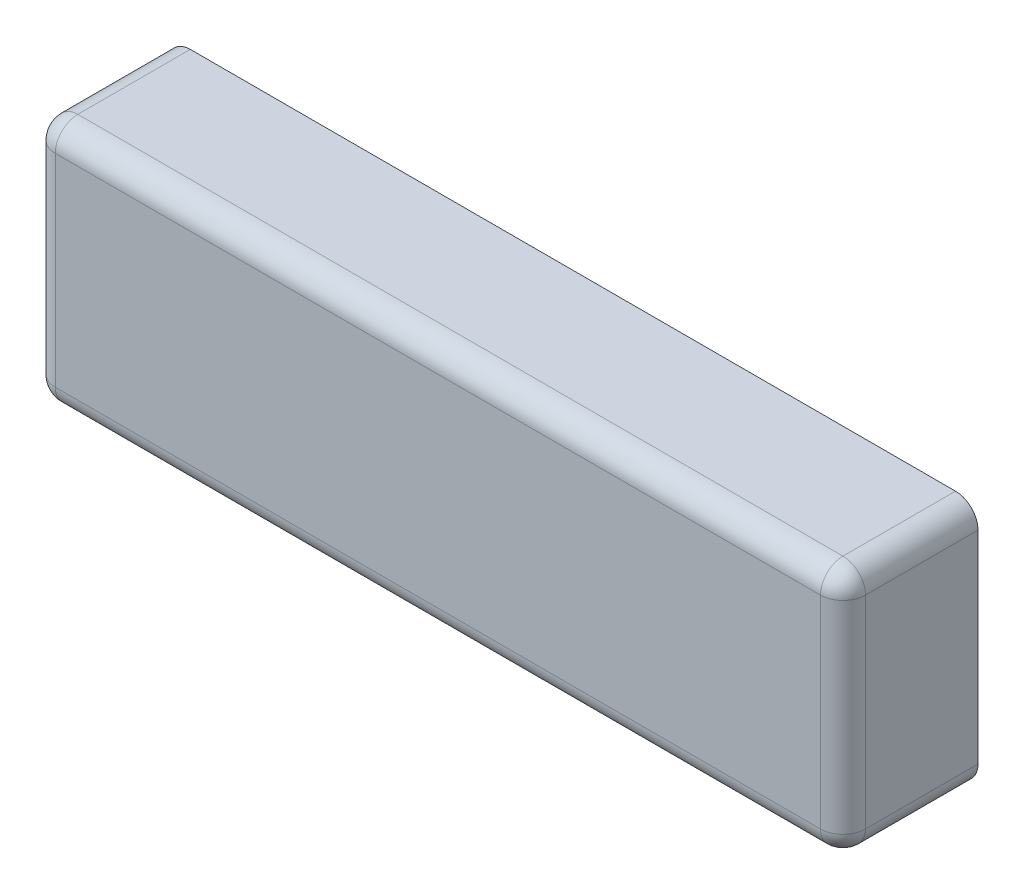
ISO-10303-21;
HEADER;
FILE_DESCRIPTION(('STEP AP214'),'2;1');
FILE_NAME('part.step','',(''),(''),'','','');
FILE_SCHEMA(('AUTOMOTIVE_DESIGN { 1 0 10303 214 1 1 1 1 }'));
ENDSEC;
DATA;
#1=APPLICATION_CONTEXT('core data for automotive mechanical design processes');
#2=APPLICATION_PROTOCOL_DEFINITION('international standard','automotive_design',2000,#1);
#3=PRODUCT_CONTEXT('',#1,'mechanical');
#4=PRODUCT('Part','Part','',(#3));
#5=PRODUCT_RELATED_PRODUCT_CATEGORY('part','',(#4));
#6=PRODUCT_DEFINITION_FORMATION('','',#4);
#7=PRODUCT_DEFINITION_CONTEXT('part definition',#1,'design');
#8=PRODUCT_DEFINITION('design','',#6,#7);
#9=PRODUCT_DEFINITION_SHAPE('','',#8);
#10=(LENGTH_UNIT() NAMED_UNIT(*) SI_UNIT(.MILLI.,.METRE.));
#11=(NAMED_UNIT(*) PLANE_ANGLE_UNIT() SI_UNIT($,.RADIAN.));
#12=(NAMED_UNIT(*) SI_UNIT($,.STERADIAN.) SOLID_ANGLE_UNIT());
#13=UNCERTAINTY_MEASURE_WITH_UNIT(LENGTH_MEASURE(1.E-05),#10,'distance_accuracy_value','');
#14=(GEOMETRIC_REPRESENTATION_CONTEXT(3) GLOBAL_UNCERTAINTY_ASSIGNED_CONTEXT((#13)) GLOBAL_UNIT_ASSIGNED_CONTEXT((#10,
#11,#12)) REPRESENTATION_CONTEXT('',''));
#15=CARTESIAN_POINT('',(0.,0.,0.));
#16=DIRECTION('',(0.,0.,1.));
#17=DIRECTION('',(1.,0.,0.));
#18=AXIS2_PLACEMENT_3D('',#15,#16,#17);
#19=CARTESIAN_POINT('',(-75.6361607142857,48.0133928571429,30.));
#20=DIRECTION('',(1.,0.,0.));
#21=DIRECTION('',(0.,1.,0.));
#22=AXIS2_PLACEMENT_3D('',#19,#20,#21);
#23=PLANE('',#22);
#24=DIRECTION('',(0.,-1.,0.));
#25=VECTOR('',#24,1.);
#26=CARTESIAN_POINT('',(-75.6361607142857,48.0133928571429,0.));
#27=LINE('',#26,#25);
#28=CARTESIAN_POINT('',(-75.6361607142857,43.0133928571429,0.));
#29=VERTEX_POINT('',#28);
#30=CARTESIAN_POINT('',(-75.6361607142857,-1.98660714285714,0.));
#31=VERTEX_POINT('',#30);
#32=EDGE_CURVE('E137',#29,#31,#27,.T.);
#33=ORIENTED_EDGE('',*,*,#32,.T.);
#34=DIRECTION('',(0.,0.,-1.));
#35=VECTOR('',#34,1.);
#36=CARTESIAN_POINT('',(-75.6361607142857,-1.98660714285714,30.));
#37=LINE('',#36,#35);
#38=CARTESIAN_POINT('',(-75.6361607142857,-1.98660714285714,25.));
#39=VERTEX_POINT('',#38);
#40=EDGE_CURVE('E114',#31,#39,#37,.F.);
#41=ORIENTED_EDGE('',*,*,#40,.T.);
#42=DIRECTION('',(0.,-1.,0.));
#43=VECTOR('',#42,1.);
#44=CARTESIAN_POINT('',(-75.6361607142857,48.0133928571429,25.));
#45=LINE('',#44,#43);
#46=CARTESIAN_POINT('',(-75.6361607142857,43.0133928571429,25.));
#47=VERTEX_POINT('',#46);
#48=EDGE_CURVE('E152',#39,#47,#45,.F.);
#49=ORIENTED_EDGE('',*,*,#48,.T.);
#50=DIRECTION('',(0.,0.,-1.));
#51=VECTOR('',#50,1.);
#52=CARTESIAN_POINT('',(-75.6361607142857,43.0133928571429,30.));
#53=LINE('',#52,#51);
#54=EDGE_CURVE('E119',#47,#29,#53,.T.);
#55=ORIENTED_EDGE('',*,*,#54,.T.);
#56=EDGE_LOOP('',(#33,#41,#49,#55));
#57=FACE_BOUND('',#56,.T.);
#58=ADVANCED_FACE('F33',(#57),#23,.F.);
#59=CARTESIAN_POINT('',(-75.6361607142857,-6.98660714285714,30.));
#60=DIRECTION('',(0.,1.,0.));
#61=DIRECTION('',(0.,0.,1.));
#62=AXIS2_PLACEMENT_3D('',#59,#60,#61);
#63=PLANE('',#62);
#64=DIRECTION('',(1.,0.,0.));
#65=VECTOR('',#64,1.);
#66=CARTESIAN_POINT('',(-75.6361607142857,-6.98660714285714,25.));
#67=LINE('',#66,#65);
#68=CARTESIAN_POINT('',(99.3638392857142,-6.98660714285714,25.));
#69=VERTEX_POINT('',#68);
#70=CARTESIAN_POINT('',(-70.6361607142857,-6.98660714285714,25.));
#71=VERTEX_POINT('',#70);
#72=EDGE_CURVE('E128',#69,#71,#67,.F.);
#73=ORIENTED_EDGE('',*,*,#72,.T.);
#74=DIRECTION('',(0.,0.,-1.));
#75=VECTOR('',#74,1.);
#76=CARTESIAN_POINT('',(-70.6361607142857,-6.98660714285714,30.));
#77=LINE('',#76,#75);
#78=CARTESIAN_POINT('',(-70.6361607142857,-6.98660714285714,0.));
#79=VERTEX_POINT('',#78);
#80=EDGE_CURVE('E113',#71,#79,#77,.T.);
#81=ORIENTED_EDGE('',*,*,#80,.T.);
#82=DIRECTION('',(1.,0.,0.));
#83=VECTOR('',#82,1.);
#84=CARTESIAN_POINT('',(-75.6361607142857,-6.98660714285714,0.));
#85=LINE('',#84,#83);
#86=CARTESIAN_POINT('',(99.3638392857142,-6.98660714285714,0.));
#87=VERTEX_POINT('',#86);
#88=EDGE_CURVE('E125',#79,#87,#85,.T.);
#89=ORIENTED_EDGE('',*,*,#88,.T.);
#90=DIRECTION('',(0.,0.,-1.));
#91=VECTOR('',#90,1.);
#92=CARTESIAN_POINT('',(99.3638392857142,-6.98660714285714,30.));
#93=LINE('',#92,#91);
#94=EDGE_CURVE('E131',#87,#69,#93,.F.);
#95=ORIENTED_EDGE('',*,*,#94,.T.);
#96=EDGE_LOOP('',(#73,#81,#89,#95));
#97=FACE_BOUND('',#96,.T.);
#98=ADVANCED_FACE('F124',(#97),#63,.F.);
#99=CARTESIAN_POINT('',(104.363839285714,48.0133928571429,30.));
#100=DIRECTION('',(-1.,0.,0.));
#101=DIRECTION('',(0.,0.,1.));
#102=AXIS2_PLACEMENT_3D('',#99,#100,#101);
#103=PLANE('',#102);
#104=DIRECTION('',(0.,1.,0.));
#105=VECTOR('',#104,1.);
#106=CARTESIAN_POINT('',(104.363839285714,-6.98660714285714,25.));
#107=LINE('',#106,#105);
#108=CARTESIAN_POINT('',(104.363839285714,43.0133928571429,25.));
#109=VERTEX_POINT('',#108);
#110=CARTESIAN_POINT('',(104.363839285714,-1.98660714285714,25.));
#111=VERTEX_POINT('',#110);
#112=EDGE_CURVE('E157',#109,#111,#107,.F.);
#113=ORIENTED_EDGE('',*,*,#112,.T.);
#114=DIRECTION('',(0.,0.,-1.));
#115=VECTOR('',#114,1.);
#116=CARTESIAN_POINT('',(104.363839285714,-1.98660714285714,30.));
#117=LINE('',#116,#115);
#118=CARTESIAN_POINT('',(104.363839285714,-1.98660714285714,0.));
#119=VERTEX_POINT('',#118);
#120=EDGE_CURVE('E159',#111,#119,#117,.T.);
#121=ORIENTED_EDGE('',*,*,#120,.T.);
#122=DIRECTION('',(0.,1.,0.));
#123=VECTOR('',#122,1.);
#124=CARTESIAN_POINT('',(104.363839285714,48.0133928571429,0.));
#125=LINE('',#124,#123);
#126=CARTESIAN_POINT('',(104.363839285714,43.0133928571429,0.));
#127=VERTEX_POINT('',#126);
#128=EDGE_CURVE('E136',#119,#127,#125,.T.);
#129=ORIENTED_EDGE('',*,*,#128,.T.);
#130=DIRECTION('',(0.,0.,-1.));
#131=VECTOR('',#130,1.);
#132=CARTESIAN_POINT('',(104.363839285714,43.0133928571429,30.));
#133=LINE('',#132,#131);
#134=EDGE_CURVE('E155',#127,#109,#133,.F.);
#135=ORIENTED_EDGE('',*,*,#134,.T.);
#136=EDGE_LOOP('',(#113,#121,#129,#135));
#137=FACE_BOUND('',#136,.T.);
#138=ADVANCED_FACE('F235',(#137),#103,.F.);
#139=CARTESIAN_POINT('',(-75.6361607142857,48.0133928571429,30.));
#140=DIRECTION('',(0.,-1.,0.));
#141=DIRECTION('',(0.,0.,-1.));
#142=AXIS2_PLACEMENT_3D('',#139,#140,#141);
#143=PLANE('',#142);
#144=DIRECTION('',(-1.,0.,0.));
#145=VECTOR('',#144,1.);
#146=CARTESIAN_POINT('',(104.363839285714,48.0133928571429,25.));
#147=LINE('',#146,#145);
#148=CARTESIAN_POINT('',(-70.6361607142857,48.0133928571429,25.));
#149=VERTEX_POINT('',#148);
#150=CARTESIAN_POINT('',(99.3638392857142,48.0133928571429,25.));
#151=VERTEX_POINT('',#150);
#152=EDGE_CURVE('E49',#149,#151,#147,.F.);
#153=ORIENTED_EDGE('',*,*,#152,.T.);
#154=DIRECTION('',(0.,0.,-1.));
#155=VECTOR('',#154,1.);
#156=CARTESIAN_POINT('',(99.3638392857142,48.0133928571429,30.));
#157=LINE('',#156,#155);
#158=CARTESIAN_POINT('',(99.3638392857142,48.0133928571429,0.));
#159=VERTEX_POINT('',#158);
#160=EDGE_CURVE('E11',#151,#159,#157,.T.);
#161=ORIENTED_EDGE('',*,*,#160,.T.);
#162=DIRECTION('',(-1.,0.,0.));
#163=VECTOR('',#162,1.);
#164=CARTESIAN_POINT('',(-75.6361607142857,48.0133928571429,0.));
#165=LINE('',#164,#163);
#166=CARTESIAN_POINT('',(-70.6361607142857,48.0133928571429,0.));
#167=VERTEX_POINT('',#166);
#168=EDGE_CURVE('E140',#159,#167,#165,.T.);
#169=ORIENTED_EDGE('',*,*,#168,.T.);
#170=DIRECTION('',(0.,0.,-1.));
#171=VECTOR('',#170,1.);
#172=CARTESIAN_POINT('',(-70.6361607142857,48.0133928571429,30.));
#173=LINE('',#172,#171);
#174=EDGE_CURVE('E42',#167,#149,#173,.F.);
#175=ORIENTED_EDGE('',*,*,#174,.T.);
#176=EDGE_LOOP('',(#153,#161,#169,#175));
#177=FACE_BOUND('',#176,.T.);
#178=ADVANCED_FACE('F214',(#177),#143,.F.);
#179=CARTESIAN_POINT('',(0.,0.,30.));
#180=DIRECTION('',(0.,0.,1.));
#181=DIRECTION('',(1.,0.,0.));
#182=AXIS2_PLACEMENT_3D('',#179,#180,#181);
#183=PLANE('',#182);
#184=DIRECTION('',(0.,-1.,0.));
#185=VECTOR('',#184,1.);
#186=CARTESIAN_POINT('',(-70.6361607142857,-6.98660714285714,30.));
#187=LINE('',#186,#185);
#188=CARTESIAN_POINT('',(-70.6361607142857,43.0133928571429,30.));
#189=VERTEX_POINT('',#188);
#190=CARTESIAN_POINT('',(-70.6361607142857,-1.98660714285714,30.));
#191=VERTEX_POINT('',#190);
#192=EDGE_CURVE('E163',#189,#191,#187,.T.);
#193=ORIENTED_EDGE('',*,*,#192,.T.);
#194=DIRECTION('',(1.,0.,0.));
#195=VECTOR('',#194,1.);
#196=CARTESIAN_POINT('',(104.363839285714,-1.98660714285714,30.));
#197=LINE('',#196,#195);
#198=CARTESIAN_POINT('',(99.3638392857142,-1.98660714285714,30.));
#199=VERTEX_POINT('',#198);
#200=EDGE_CURVE('E167',#191,#199,#197,.T.);
#201=ORIENTED_EDGE('',*,*,#200,.T.);
#202=DIRECTION('',(0.,1.,0.));
#203=VECTOR('',#202,1.);
#204=CARTESIAN_POINT('',(99.3638392857142,48.0133928571429,30.));
#205=LINE('',#204,#203);
#206=CARTESIAN_POINT('',(99.3638392857142,43.0133928571429,30.));
#207=VERTEX_POINT('',#206);
#208=EDGE_CURVE('E165',#199,#207,#205,.T.);
#209=ORIENTED_EDGE('',*,*,#208,.T.);
#210=DIRECTION('',(-1.,0.,0.));
#211=VECTOR('',#210,1.);
#212=CARTESIAN_POINT('',(-75.6361607142857,43.0133928571429,30.));
#213=LINE('',#212,#211);
#214=EDGE_CURVE('E161',#207,#189,#213,.T.);
#215=ORIENTED_EDGE('',*,*,#214,.T.);
#216=EDGE_LOOP('',(#193,#201,#209,#215));
#217=FACE_BOUND('',#216,.T.);
#218=ADVANCED_FACE('F227',(#217),#183,.T.);
#219=CARTESIAN_POINT('',(0.,0.,0.));
#220=DIRECTION('',(0.,0.,1.));
#221=DIRECTION('',(1.,0.,0.));
#222=AXIS2_PLACEMENT_3D('',#219,#220,#221);
#223=PLANE('',#222);
#224=ORIENTED_EDGE('',*,*,#88,.F.);
#225=CARTESIAN_POINT('',(-70.6361607142857,-1.98660714285714,0.));
#226=DIRECTION('',(0.,0.,1.));
#227=DIRECTION('',(1.,0.,0.));
#228=AXIS2_PLACEMENT_3D('',#225,#226,#227);
#229=CIRCLE('',#228,5.);
#230=EDGE_CURVE('E109',#79,#31,#229,.F.);
#231=ORIENTED_EDGE('',*,*,#230,.T.);
#232=ORIENTED_EDGE('',*,*,#32,.F.);
#233=CARTESIAN_POINT('',(-70.6361607142857,43.0133928571429,0.));
#234=DIRECTION('',(0.,0.,1.));
#235=DIRECTION('',(1.,0.,0.));
#236=AXIS2_PLACEMENT_3D('',#233,#234,#235);
#237=CIRCLE('',#236,5.);
#238=EDGE_CURVE('E130',#29,#167,#237,.F.);
#239=ORIENTED_EDGE('',*,*,#238,.T.);
#240=ORIENTED_EDGE('',*,*,#168,.F.);
#241=CARTESIAN_POINT('',(99.3638392857142,43.0133928571429,0.));
#242=DIRECTION('',(0.,0.,1.));
#243=DIRECTION('',(1.,0.,0.));
#244=AXIS2_PLACEMENT_3D('',#241,#242,#243);
#245=CIRCLE('',#244,5.);
#246=EDGE_CURVE('E148',#159,#127,#245,.F.);
#247=ORIENTED_EDGE('',*,*,#246,.T.);
#248=ORIENTED_EDGE('',*,*,#128,.F.);
#249=CARTESIAN_POINT('',(99.3638392857142,-1.98660714285714,0.));
#250=DIRECTION('',(0.,0.,1.));
#251=DIRECTION('',(1.,0.,0.));
#252=AXIS2_PLACEMENT_3D('',#249,#250,#251);
#253=CIRCLE('',#252,5.);
#254=EDGE_CURVE('E120',#119,#87,#253,.F.);
#255=ORIENTED_EDGE('',*,*,#254,.T.);
#256=EDGE_LOOP('',(#224,#231,#232,#239,#240,#247,#248,#255));
#257=FACE_BOUND('',#256,.T.);
#258=ADVANCED_FACE('F133',(#257),#223,.F.);
#259=CARTESIAN_POINT('',(99.3638392857142,43.0133928571429,30.));
#260=DIRECTION('',(0.,0.,-1.));
#261=DIRECTION('',(-1.,0.,0.));
#262=AXIS2_PLACEMENT_3D('',#259,#260,#261);
#263=CYLINDRICAL_SURFACE('',#262,5.);
#264=CARTESIAN_POINT('',(99.3638392857142,43.0133928571429,25.));
#265=DIRECTION('',(0.,0.,1.));
#266=DIRECTION('',(1.,0.,0.));
#267=AXIS2_PLACEMENT_3D('',#264,#265,#266);
#268=CIRCLE('',#267,5.);
#269=EDGE_CURVE('E37',#109,#151,#268,.T.);
#270=ORIENTED_EDGE('',*,*,#269,.F.);
#271=ORIENTED_EDGE('',*,*,#134,.F.);
#272=ORIENTED_EDGE('',*,*,#246,.F.);
#273=ORIENTED_EDGE('',*,*,#160,.F.);
#274=EDGE_LOOP('',(#270,#271,#272,#273));
#275=FACE_BOUND('',#274,.T.);
#276=ADVANCED_FACE('F35',(#275),#263,.T.);
#277=CARTESIAN_POINT('',(99.3638392857142,43.0133928571429,25.));
#278=DIRECTION('',(0.,0.,1.));
#279=DIRECTION('',(1.,0.,0.));
#280=AXIS2_PLACEMENT_3D('',#277,#278,#279);
#281=SPHERICAL_SURFACE('',#280,5.);
#282=CARTESIAN_POINT('',(99.3638392857142,43.0133928571429,25.));
#283=DIRECTION('',(0.,1.,0.));
#284=DIRECTION('',(0.,0.,1.));
#285=AXIS2_PLACEMENT_3D('',#282,#283,#284);
#286=CIRCLE('',#285,5.);
#287=EDGE_CURVE('E197',#109,#207,#286,.F.);
#288=ORIENTED_EDGE('',*,*,#287,.F.);
#289=ORIENTED_EDGE('',*,*,#269,.T.);
#290=CARTESIAN_POINT('',(99.3638392857142,43.0133928571429,25.));
#291=DIRECTION('',(1.,0.,0.));
#292=DIRECTION('',(0.,0.,-1.));
#293=AXIS2_PLACEMENT_3D('',#290,#291,#292);
#294=CIRCLE('',#293,5.);
#295=EDGE_CURVE('E199',#207,#151,#294,.F.);
#296=ORIENTED_EDGE('',*,*,#295,.F.);
#297=EDGE_LOOP('',(#288,#289,#296));
#298=FACE_BOUND('',#297,.T.);
#299=ADVANCED_FACE('F208',(#298),#281,.T.);
#300=CARTESIAN_POINT('',(-70.6361607142857,43.0133928571429,30.));
#301=DIRECTION('',(0.,0.,-1.));
#302=DIRECTION('',(-1.,0.,0.));
#303=AXIS2_PLACEMENT_3D('',#300,#301,#302);
#304=CYLINDRICAL_SURFACE('',#303,5.);
#305=ORIENTED_EDGE('',*,*,#238,.F.);
#306=ORIENTED_EDGE('',*,*,#54,.F.);
#307=CARTESIAN_POINT('',(-70.6361607142857,43.0133928571429,25.));
#308=DIRECTION('',(0.,0.,1.));
#309=DIRECTION('',(1.,0.,0.));
#310=AXIS2_PLACEMENT_3D('',#307,#308,#309);
#311=CIRCLE('',#310,5.);
#312=EDGE_CURVE('E194',#149,#47,#311,.T.);
#313=ORIENTED_EDGE('',*,*,#312,.F.);
#314=ORIENTED_EDGE('',*,*,#174,.F.);
#315=EDGE_LOOP('',(#305,#306,#313,#314));
#316=FACE_BOUND('',#315,.T.);
#317=ADVANCED_FACE('F218',(#316),#304,.T.);
#318=CARTESIAN_POINT('',(0.,43.0133928571429,25.));
#319=DIRECTION('',(1.,0.,0.));
#320=DIRECTION('',(0.,0.,-1.));
#321=AXIS2_PLACEMENT_3D('',#318,#319,#320);
#322=CYLINDRICAL_SURFACE('',#321,5.);
#323=ORIENTED_EDGE('',*,*,#295,.T.);
#324=ORIENTED_EDGE('',*,*,#152,.F.);
#325=CARTESIAN_POINT('',(-70.6361607142857,43.0133928571429,25.));
#326=DIRECTION('',(-1.,0.,0.));
#327=DIRECTION('',(0.,0.,1.));
#328=AXIS2_PLACEMENT_3D('',#325,#326,#327);
#329=CIRCLE('',#328,5.);
#330=EDGE_CURVE('E191',#189,#149,#329,.T.);
#331=ORIENTED_EDGE('',*,*,#330,.F.);
#332=ORIENTED_EDGE('',*,*,#214,.F.);
#333=EDGE_LOOP('',(#323,#324,#331,#332));
#334=FACE_BOUND('',#333,.T.);
#335=ADVANCED_FACE('F225',(#334),#322,.T.);
#336=CARTESIAN_POINT('',(99.3638392857142,0.,25.));
#337=DIRECTION('',(0.,-1.,0.));
#338=DIRECTION('',(0.,0.,-1.));
#339=AXIS2_PLACEMENT_3D('',#336,#337,#338);
#340=CYLINDRICAL_SURFACE('',#339,5.);
#341=ORIENTED_EDGE('',*,*,#287,.T.);
#342=ORIENTED_EDGE('',*,*,#208,.F.);
#343=CARTESIAN_POINT('',(99.3638392857142,-1.98660714285714,25.));
#344=DIRECTION('',(0.,-1.,0.));
#345=DIRECTION('',(0.,0.,-1.));
#346=AXIS2_PLACEMENT_3D('',#343,#344,#345);
#347=CIRCLE('',#346,5.);
#348=EDGE_CURVE('E188',#111,#199,#347,.T.);
#349=ORIENTED_EDGE('',*,*,#348,.F.);
#350=ORIENTED_EDGE('',*,*,#112,.F.);
#351=EDGE_LOOP('',(#341,#342,#349,#350));
#352=FACE_BOUND('',#351,.T.);
#353=ADVANCED_FACE('F232',(#352),#340,.T.);
#354=CARTESIAN_POINT('',(99.3638392857142,-1.98660714285714,30.));
#355=DIRECTION('',(0.,0.,-1.));
#356=DIRECTION('',(-1.,0.,0.));
#357=AXIS2_PLACEMENT_3D('',#354,#355,#356);
#358=CYLINDRICAL_SURFACE('',#357,5.);
#359=ORIENTED_EDGE('',*,*,#254,.F.);
#360=ORIENTED_EDGE('',*,*,#120,.F.);
#361=CARTESIAN_POINT('',(99.3638392857142,-1.98660714285714,25.));
#362=DIRECTION('',(0.,0.,1.));
#363=DIRECTION('',(1.,0.,0.));
#364=AXIS2_PLACEMENT_3D('',#361,#362,#363);
#365=CIRCLE('',#364,5.);
#366=EDGE_CURVE('E185',#69,#111,#365,.T.);
#367=ORIENTED_EDGE('',*,*,#366,.F.);
#368=ORIENTED_EDGE('',*,*,#94,.F.);
#369=EDGE_LOOP('',(#359,#360,#367,#368));
#370=FACE_BOUND('',#369,.T.);
#371=ADVANCED_FACE('F238',(#370),#358,.T.);
#372=CARTESIAN_POINT('',(-70.6361607142857,43.0133928571429,25.));
#373=DIRECTION('',(0.,0.,1.));
#374=DIRECTION('',(1.,0.,0.));
#375=AXIS2_PLACEMENT_3D('',#372,#373,#374);
#376=SPHERICAL_SURFACE('',#375,5.);
#377=ORIENTED_EDGE('',*,*,#330,.T.);
#378=ORIENTED_EDGE('',*,*,#312,.T.);
#379=CARTESIAN_POINT('',(-70.6361607142857,43.0133928571429,25.));
#380=DIRECTION('',(0.,1.,0.));
#381=DIRECTION('',(0.,0.,1.));
#382=AXIS2_PLACEMENT_3D('',#379,#380,#381);
#383=CIRCLE('',#382,5.);
#384=EDGE_CURVE('E182',#189,#47,#383,.F.);
#385=ORIENTED_EDGE('',*,*,#384,.F.);
#386=EDGE_LOOP('',(#377,#378,#385));
#387=FACE_BOUND('',#386,.T.);
#388=ADVANCED_FACE('F223',(#387),#376,.T.);
#389=CARTESIAN_POINT('',(99.3638392857142,-1.98660714285714,25.));
#390=DIRECTION('',(0.,0.,1.));
#391=DIRECTION('',(1.,0.,0.));
#392=AXIS2_PLACEMENT_3D('',#389,#390,#391);
#393=SPHERICAL_SURFACE('',#392,5.);
#394=ORIENTED_EDGE('',*,*,#366,.T.);
#395=ORIENTED_EDGE('',*,*,#348,.T.);
#396=CARTESIAN_POINT('',(99.3638392857142,-1.98660714285714,25.));
#397=DIRECTION('',(1.,0.,0.));
#398=DIRECTION('',(0.,0.,-1.));
#399=AXIS2_PLACEMENT_3D('',#396,#397,#398);
#400=CIRCLE('',#399,5.);
#401=EDGE_CURVE('E180',#69,#199,#400,.F.);
#402=ORIENTED_EDGE('',*,*,#401,.F.);
#403=EDGE_LOOP('',(#394,#395,#402));
#404=FACE_BOUND('',#403,.T.);
#405=ADVANCED_FACE('F241',(#404),#393,.T.);
#406=CARTESIAN_POINT('',(-70.6361607142857,0.,25.));
#407=DIRECTION('',(0.,1.,0.));
#408=DIRECTION('',(-1.,0.,0.));
#409=AXIS2_PLACEMENT_3D('',#406,#407,#408);
#410=CYLINDRICAL_SURFACE('',#409,5.);
#411=ORIENTED_EDGE('',*,*,#384,.T.);
#412=ORIENTED_EDGE('',*,*,#48,.F.);
#413=CARTESIAN_POINT('',(-70.6361607142857,-1.98660714285714,25.));
#414=DIRECTION('',(0.,-1.,0.));
#415=DIRECTION('',(1.,0.,0.));
#416=AXIS2_PLACEMENT_3D('',#413,#414,#415);
#417=CIRCLE('',#416,5.);
#418=EDGE_CURVE('E177',#191,#39,#417,.T.);
#419=ORIENTED_EDGE('',*,*,#418,.F.);
#420=ORIENTED_EDGE('',*,*,#192,.F.);
#421=EDGE_LOOP('',(#411,#412,#419,#420));
#422=FACE_BOUND('',#421,.T.);
#423=ADVANCED_FACE('F250',(#422),#410,.T.);
#424=CARTESIAN_POINT('',(0.,-1.98660714285714,25.));
#425=DIRECTION('',(-1.,0.,0.));
#426=DIRECTION('',(0.,0.,1.));
#427=AXIS2_PLACEMENT_3D('',#424,#425,#426);
#428=CYLINDRICAL_SURFACE('',#427,5.);
#429=ORIENTED_EDGE('',*,*,#401,.T.);
#430=ORIENTED_EDGE('',*,*,#200,.F.);
#431=CARTESIAN_POINT('',(-70.6361607142857,-1.98660714285714,25.));
#432=DIRECTION('',(-1.,0.,0.));
#433=DIRECTION('',(0.,0.,1.));
#434=AXIS2_PLACEMENT_3D('',#431,#432,#433);
#435=CIRCLE('',#434,5.);
#436=EDGE_CURVE('E174',#71,#191,#435,.T.);
#437=ORIENTED_EDGE('',*,*,#436,.F.);
#438=ORIENTED_EDGE('',*,*,#72,.F.);
#439=EDGE_LOOP('',(#429,#430,#437,#438));
#440=FACE_BOUND('',#439,.T.);
#441=ADVANCED_FACE('F243',(#440),#428,.T.);
#442=CARTESIAN_POINT('',(-70.6361607142857,-1.98660714285714,25.));
#443=DIRECTION('',(0.,0.,1.));
#444=DIRECTION('',(1.,0.,0.));
#445=AXIS2_PLACEMENT_3D('',#442,#443,#444);
#446=SPHERICAL_SURFACE('',#445,5.);
#447=ORIENTED_EDGE('',*,*,#436,.T.);
#448=ORIENTED_EDGE('',*,*,#418,.T.);
#449=CARTESIAN_POINT('',(-70.6361607142857,-1.98660714285714,25.));
#450=DIRECTION('',(0.,0.,1.));
#451=DIRECTION('',(1.,0.,0.));
#452=AXIS2_PLACEMENT_3D('',#449,#450,#451);
#453=CIRCLE('',#452,5.);
#454=EDGE_CURVE('E172',#71,#39,#453,.F.);
#455=ORIENTED_EDGE('',*,*,#454,.F.);
#456=EDGE_LOOP('',(#447,#448,#455));
#457=FACE_BOUND('',#456,.T.);
#458=ADVANCED_FACE('F247',(#457),#446,.T.);
#459=CARTESIAN_POINT('',(-70.6361607142857,-1.98660714285714,30.));
#460=DIRECTION('',(0.,0.,-1.));
#461=DIRECTION('',(-1.,0.,0.));
#462=AXIS2_PLACEMENT_3D('',#459,#460,#461);
#463=CYLINDRICAL_SURFACE('',#462,5.);
#464=ORIENTED_EDGE('',*,*,#454,.T.);
#465=ORIENTED_EDGE('',*,*,#40,.F.);
#466=ORIENTED_EDGE('',*,*,#230,.F.);
#467=ORIENTED_EDGE('',*,*,#80,.F.);
#468=EDGE_LOOP('',(#464,#465,#466,#467));
#469=FACE_BOUND('',#468,.T.);
#470=ADVANCED_FACE('F112',(#469),#463,.T.);
#471=CLOSED_SHELL('',(#58,#98,#138,#178,#218,#258,#276,#299,#317,#335,#353,#371,#388,#405,#423,
#441,#458,#470));
#472=MANIFOLD_SOLID_BREP('B2',#471);
#473=ADVANCED_BREP_SHAPE_REPRESENTATION('',(#18,#472),#14);
#474=SHAPE_DEFINITION_REPRESENTATION(#9,#473);
ENDSEC;
END-ISO-10303-21;
